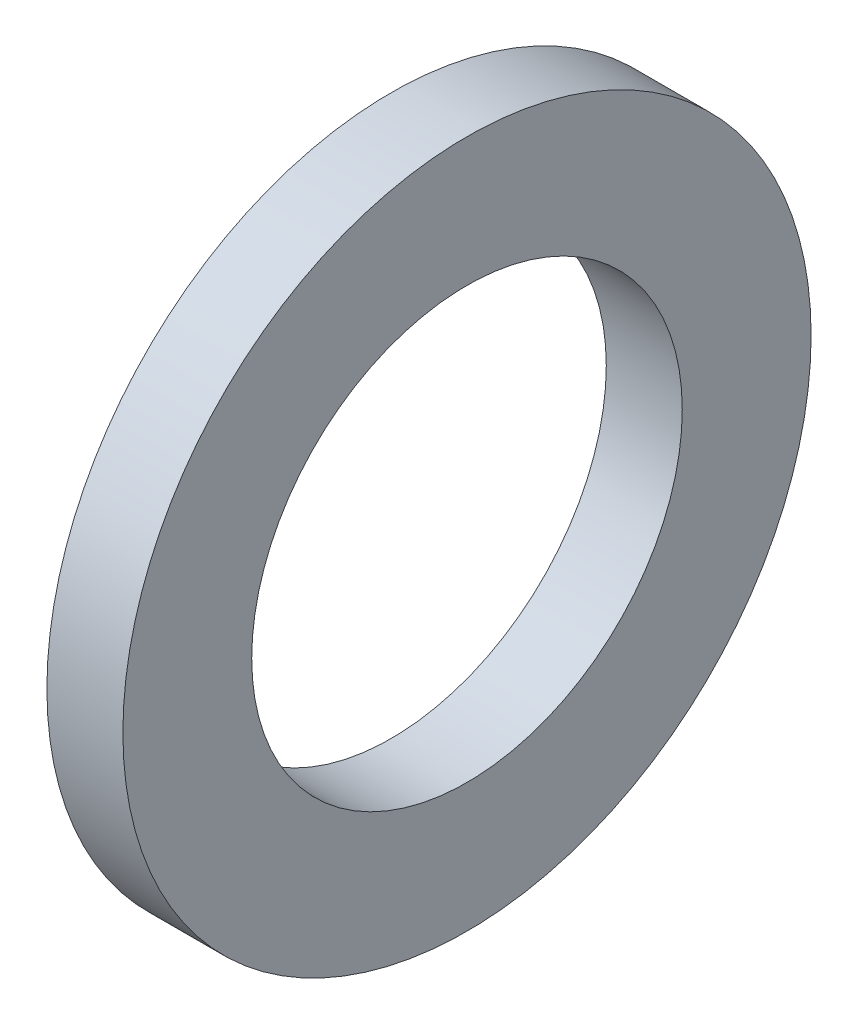
ISO-10303-21;
HEADER;
FILE_DESCRIPTION(('STEP AP214'),'2;1');
FILE_NAME('part.step','',(''),(''),'','','');
FILE_SCHEMA(('AUTOMOTIVE_DESIGN { 1 0 10303 214 1 1 1 1 }'));
ENDSEC;
DATA;
#1=APPLICATION_CONTEXT('core data for automotive mechanical design processes');
#2=APPLICATION_PROTOCOL_DEFINITION('international standard','automotive_design',2000,#1);
#3=PRODUCT_CONTEXT('',#1,'mechanical');
#4=PRODUCT('Part','Part','',(#3));
#5=PRODUCT_RELATED_PRODUCT_CATEGORY('part','',(#4));
#6=PRODUCT_DEFINITION_FORMATION('','',#4);
#7=PRODUCT_DEFINITION_CONTEXT('part definition',#1,'design');
#8=PRODUCT_DEFINITION('design','',#6,#7);
#9=PRODUCT_DEFINITION_SHAPE('','',#8);
#10=(LENGTH_UNIT() NAMED_UNIT(*) SI_UNIT(.MILLI.,.METRE.));
#11=(NAMED_UNIT(*) PLANE_ANGLE_UNIT() SI_UNIT($,.RADIAN.));
#12=(NAMED_UNIT(*) SI_UNIT($,.STERADIAN.) SOLID_ANGLE_UNIT());
#13=UNCERTAINTY_MEASURE_WITH_UNIT(LENGTH_MEASURE(1.E-05),#10,'distance_accuracy_value','');
#14=(GEOMETRIC_REPRESENTATION_CONTEXT(3) GLOBAL_UNCERTAINTY_ASSIGNED_CONTEXT((#13)) GLOBAL_UNIT_ASSIGNED_CONTEXT((#10,
#11,#12)) REPRESENTATION_CONTEXT('',''));
#15=CARTESIAN_POINT('',(0.,0.,0.));
#16=DIRECTION('',(0.,0.,1.));
#17=DIRECTION('',(1.,0.,0.));
#18=AXIS2_PLACEMENT_3D('',#15,#16,#17);
#19=CARTESIAN_POINT('',(1.7526,0.,0.));
#20=DIRECTION('',(1.,0.,0.));
#21=DIRECTION('',(0.,0.,-1.));
#22=AXIS2_PLACEMENT_3D('',#19,#20,#21);
#23=PLANE('',#22);
#24=CARTESIAN_POINT('',(1.7526,0.,0.));
#25=DIRECTION('',(1.,0.,0.));
#26=DIRECTION('',(0.,0.,-1.));
#27=AXIS2_PLACEMENT_3D('',#24,#25,#26);
#28=CIRCLE('',#27,7.9375);
#29=CARTESIAN_POINT('',(1.7526,0.,-7.9375));
#30=VERTEX_POINT('',#29);
#31=EDGE_CURVE('E10',#30,#30,#28,.T.);
#32=ORIENTED_EDGE('',*,*,#31,.T.);
#33=EDGE_LOOP('',(#32));
#34=FACE_BOUND('',#33,.T.);
#35=CARTESIAN_POINT('',(1.7526,0.,0.));
#36=DIRECTION('',(1.,0.,0.));
#37=DIRECTION('',(0.,0.,-1.));
#38=AXIS2_PLACEMENT_3D('',#35,#36,#37);
#39=CIRCLE('',#38,4.9657);
#40=CARTESIAN_POINT('',(1.7526,0.,-4.9657));
#41=VERTEX_POINT('',#40);
#42=EDGE_CURVE('E41',#41,#41,#39,.T.);
#43=ORIENTED_EDGE('',*,*,#42,.F.);
#44=EDGE_LOOP('',(#43));
#45=FACE_BOUND('',#44,.T.);
#46=ADVANCED_FACE('F30',(#34,#45),#23,.T.);
#47=CARTESIAN_POINT('',(0.,0.,0.));
#48=DIRECTION('',(1.,0.,0.));
#49=DIRECTION('',(0.,0.,-1.));
#50=AXIS2_PLACEMENT_3D('',#47,#48,#49);
#51=PLANE('',#50);
#52=CARTESIAN_POINT('',(0.,0.,0.));
#53=DIRECTION('',(1.,0.,0.));
#54=DIRECTION('',(0.,0.,-1.));
#55=AXIS2_PLACEMENT_3D('',#52,#53,#54);
#56=CIRCLE('',#55,7.9375);
#57=CARTESIAN_POINT('',(0.,0.,-7.9375));
#58=VERTEX_POINT('',#57);
#59=EDGE_CURVE('E34',#58,#58,#56,.T.);
#60=ORIENTED_EDGE('',*,*,#59,.F.);
#61=EDGE_LOOP('',(#60));
#62=FACE_BOUND('',#61,.T.);
#63=CARTESIAN_POINT('',(0.,0.,0.));
#64=DIRECTION('',(1.,0.,0.));
#65=DIRECTION('',(0.,0.,-1.));
#66=AXIS2_PLACEMENT_3D('',#63,#64,#65);
#67=CIRCLE('',#66,4.9657);
#68=CARTESIAN_POINT('',(0.,0.,-4.9657));
#69=VERTEX_POINT('',#68);
#70=EDGE_CURVE('E43',#69,#69,#67,.T.);
#71=ORIENTED_EDGE('',*,*,#70,.T.);
#72=EDGE_LOOP('',(#71));
#73=FACE_BOUND('',#72,.T.);
#74=ADVANCED_FACE('F53',(#62,#73),#51,.F.);
#75=CARTESIAN_POINT('',(1.7526,0.,0.));
#76=DIRECTION('',(-1.,0.,0.));
#77=DIRECTION('',(0.,0.,1.));
#78=AXIS2_PLACEMENT_3D('',#75,#76,#77);
#79=CYLINDRICAL_SURFACE('',#78,7.9375);
#80=ORIENTED_EDGE('',*,*,#31,.F.);
#81=EDGE_LOOP('',(#80));
#82=FACE_BOUND('',#81,.T.);
#83=ORIENTED_EDGE('',*,*,#59,.T.);
#84=EDGE_LOOP('',(#83));
#85=FACE_BOUND('',#84,.T.);
#86=ADVANCED_FACE('F32',(#82,#85),#79,.T.);
#87=CARTESIAN_POINT('',(1.7526,0.,0.));
#88=DIRECTION('',(-1.,0.,0.));
#89=DIRECTION('',(0.,0.,1.));
#90=AXIS2_PLACEMENT_3D('',#87,#88,#89);
#91=CYLINDRICAL_SURFACE('',#90,4.9657);
#92=ORIENTED_EDGE('',*,*,#42,.T.);
#93=EDGE_LOOP('',(#92));
#94=FACE_BOUND('',#93,.T.);
#95=ORIENTED_EDGE('',*,*,#70,.F.);
#96=EDGE_LOOP('',(#95));
#97=FACE_BOUND('',#96,.T.);
#98=ADVANCED_FACE('F49',(#94,#97),#91,.F.);
#99=CLOSED_SHELL('',(#46,#74,#86,#98));
#100=MANIFOLD_SOLID_BREP('B2',#99);
#101=ADVANCED_BREP_SHAPE_REPRESENTATION('',(#18,#100),#14);
#102=SHAPE_DEFINITION_REPRESENTATION(#9,#101);
ENDSEC;
END-ISO-10303-21;
